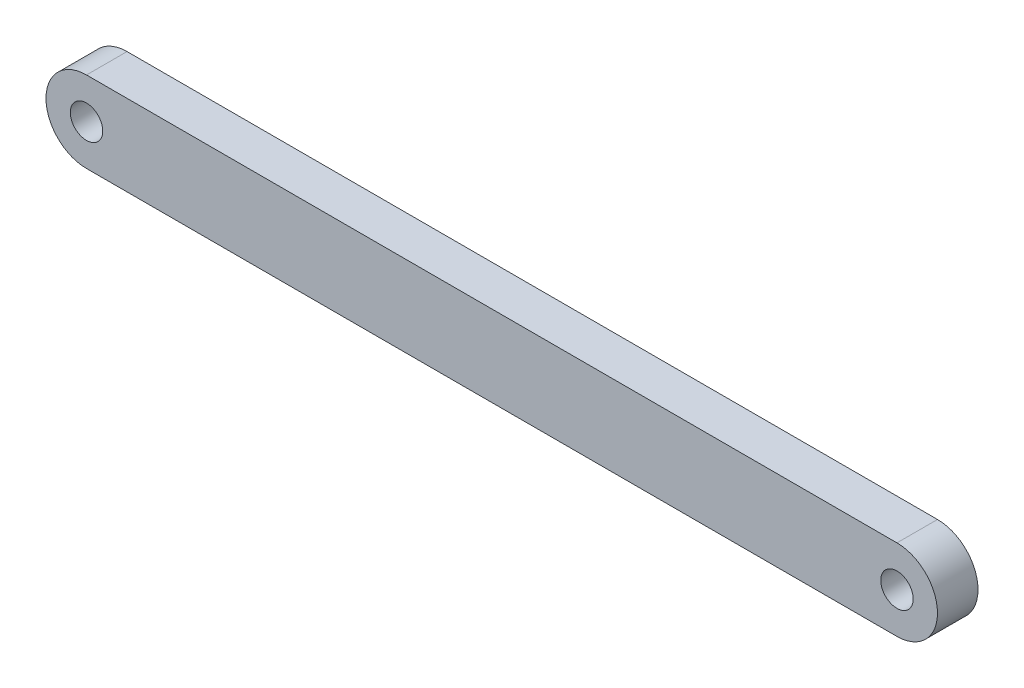
ISO-10303-21;
HEADER;
FILE_DESCRIPTION(('STEP AP214'),'2;1');
FILE_NAME('part.step','',(''),(''),'','','');
FILE_SCHEMA(('AUTOMOTIVE_DESIGN { 1 0 10303 214 1 1 1 1 }'));
ENDSEC;
DATA;
#1=APPLICATION_CONTEXT('core data for automotive mechanical design processes');
#2=APPLICATION_PROTOCOL_DEFINITION('international standard','automotive_design',2000,#1);
#3=PRODUCT_CONTEXT('',#1,'mechanical');
#4=PRODUCT('Part','Part','',(#3));
#5=PRODUCT_RELATED_PRODUCT_CATEGORY('part','',(#4));
#6=PRODUCT_DEFINITION_FORMATION('','',#4);
#7=PRODUCT_DEFINITION_CONTEXT('part definition',#1,'design');
#8=PRODUCT_DEFINITION('design','',#6,#7);
#9=PRODUCT_DEFINITION_SHAPE('','',#8);
#10=(LENGTH_UNIT() NAMED_UNIT(*) SI_UNIT(.MILLI.,.METRE.));
#11=(NAMED_UNIT(*) PLANE_ANGLE_UNIT() SI_UNIT($,.RADIAN.));
#12=(NAMED_UNIT(*) SI_UNIT($,.STERADIAN.) SOLID_ANGLE_UNIT());
#13=UNCERTAINTY_MEASURE_WITH_UNIT(LENGTH_MEASURE(1.E-05),#10,'distance_accuracy_value','');
#14=(GEOMETRIC_REPRESENTATION_CONTEXT(3) GLOBAL_UNCERTAINTY_ASSIGNED_CONTEXT((#13)) GLOBAL_UNIT_ASSIGNED_CONTEXT((#10,
#11,#12)) REPRESENTATION_CONTEXT('',''));
#15=CARTESIAN_POINT('',(0.,0.,0.));
#16=DIRECTION('',(0.,0.,1.));
#17=DIRECTION('',(1.,0.,0.));
#18=AXIS2_PLACEMENT_3D('',#15,#16,#17);
#19=CARTESIAN_POINT('',(0.,0.,5.));
#20=DIRECTION('',(0.,0.,1.));
#21=DIRECTION('',(1.,0.,0.));
#22=AXIS2_PLACEMENT_3D('',#19,#20,#21);
#23=PLANE('',#22);
#24=CARTESIAN_POINT('',(0.,0.,5.));
#25=DIRECTION('',(0.,0.,1.));
#26=DIRECTION('',(1.,0.,0.));
#27=AXIS2_PLACEMENT_3D('',#24,#25,#26);
#28=CIRCLE('',#27,2.);
#29=CARTESIAN_POINT('',(2.,0.,5.));
#30=VERTEX_POINT('',#29);
#31=EDGE_CURVE('E118',#30,#30,#28,.T.);
#32=ORIENTED_EDGE('',*,*,#31,.F.);
#33=EDGE_LOOP('',(#32));
#34=FACE_BOUND('',#33,.T.);
#35=CARTESIAN_POINT('',(0.,0.,5.));
#36=DIRECTION('',(0.,0.,1.));
#37=DIRECTION('',(1.,0.,0.));
#38=AXIS2_PLACEMENT_3D('',#35,#36,#37);
#39=CIRCLE('',#38,5.);
#40=CARTESIAN_POINT('',(0.,5.,5.));
#41=VERTEX_POINT('',#40);
#42=CARTESIAN_POINT('',(0.,-5.,5.));
#43=VERTEX_POINT('',#42);
#44=EDGE_CURVE('E98',#41,#43,#39,.T.);
#45=ORIENTED_EDGE('',*,*,#44,.T.);
#46=DIRECTION('',(1.,0.,0.));
#47=VECTOR('',#46,1.);
#48=CARTESIAN_POINT('',(0.,-5.,5.));
#49=LINE('',#48,#47);
#50=CARTESIAN_POINT('',(100.,-5.,5.));
#51=VERTEX_POINT('',#50);
#52=EDGE_CURVE('E93',#43,#51,#49,.T.);
#53=ORIENTED_EDGE('',*,*,#52,.T.);
#54=CARTESIAN_POINT('',(100.,0.,5.));
#55=DIRECTION('',(0.,0.,1.));
#56=DIRECTION('',(1.,0.,0.));
#57=AXIS2_PLACEMENT_3D('',#54,#55,#56);
#58=CIRCLE('',#57,5.);
#59=CARTESIAN_POINT('',(100.,5.,5.));
#60=VERTEX_POINT('',#59);
#61=EDGE_CURVE('E96',#51,#60,#58,.T.);
#62=ORIENTED_EDGE('',*,*,#61,.T.);
#63=DIRECTION('',(-1.,0.,0.));
#64=VECTOR('',#63,1.);
#65=CARTESIAN_POINT('',(0.,5.,5.));
#66=LINE('',#65,#64);
#67=EDGE_CURVE('E63',#60,#41,#66,.T.);
#68=ORIENTED_EDGE('',*,*,#67,.T.);
#69=EDGE_LOOP('',(#45,#53,#62,#68));
#70=FACE_BOUND('',#69,.T.);
#71=CARTESIAN_POINT('',(100.,0.,5.));
#72=DIRECTION('',(0.,0.,1.));
#73=DIRECTION('',(1.,0.,0.));
#74=AXIS2_PLACEMENT_3D('',#71,#72,#73);
#75=CIRCLE('',#74,2.00000000000001);
#76=CARTESIAN_POINT('',(102.,0.,5.));
#77=VERTEX_POINT('',#76);
#78=EDGE_CURVE('E140',#77,#77,#75,.T.);
#79=ORIENTED_EDGE('',*,*,#78,.F.);
#80=EDGE_LOOP('',(#79));
#81=FACE_BOUND('',#80,.T.);
#82=ADVANCED_FACE('F45',(#34,#70,#81),#23,.T.);
#83=CARTESIAN_POINT('',(0.,0.,0.));
#84=DIRECTION('',(0.,0.,1.));
#85=DIRECTION('',(1.,0.,0.));
#86=AXIS2_PLACEMENT_3D('',#83,#84,#85);
#87=PLANE('',#86);
#88=CARTESIAN_POINT('',(0.,0.,0.));
#89=DIRECTION('',(0.,0.,1.));
#90=DIRECTION('',(1.,0.,0.));
#91=AXIS2_PLACEMENT_3D('',#88,#89,#90);
#92=CIRCLE('',#91,5.);
#93=CARTESIAN_POINT('',(0.,5.,0.));
#94=VERTEX_POINT('',#93);
#95=CARTESIAN_POINT('',(0.,-5.,0.));
#96=VERTEX_POINT('',#95);
#97=EDGE_CURVE('E114',#94,#96,#92,.T.);
#98=ORIENTED_EDGE('',*,*,#97,.F.);
#99=DIRECTION('',(-1.,0.,0.));
#100=VECTOR('',#99,1.);
#101=CARTESIAN_POINT('',(0.,5.,0.));
#102=LINE('',#101,#100);
#103=CARTESIAN_POINT('',(100.,5.,0.));
#104=VERTEX_POINT('',#103);
#105=EDGE_CURVE('E86',#104,#94,#102,.T.);
#106=ORIENTED_EDGE('',*,*,#105,.F.);
#107=CARTESIAN_POINT('',(100.,0.,0.));
#108=DIRECTION('',(0.,0.,1.));
#109=DIRECTION('',(1.,0.,0.));
#110=AXIS2_PLACEMENT_3D('',#107,#108,#109);
#111=CIRCLE('',#110,5.);
#112=CARTESIAN_POINT('',(100.,-5.,0.));
#113=VERTEX_POINT('',#112);
#114=EDGE_CURVE('E80',#113,#104,#111,.T.);
#115=ORIENTED_EDGE('',*,*,#114,.F.);
#116=DIRECTION('',(1.,0.,0.));
#117=VECTOR('',#116,1.);
#118=CARTESIAN_POINT('',(0.,-5.,0.));
#119=LINE('',#118,#117);
#120=EDGE_CURVE('E103',#96,#113,#119,.T.);
#121=ORIENTED_EDGE('',*,*,#120,.F.);
#122=EDGE_LOOP('',(#98,#106,#115,#121));
#123=FACE_BOUND('',#122,.T.);
#124=CARTESIAN_POINT('',(0.,0.,0.));
#125=DIRECTION('',(0.,0.,1.));
#126=DIRECTION('',(1.,0.,0.));
#127=AXIS2_PLACEMENT_3D('',#124,#125,#126);
#128=CIRCLE('',#127,2.);
#129=CARTESIAN_POINT('',(2.,0.,0.));
#130=VERTEX_POINT('',#129);
#131=EDGE_CURVE('E136',#130,#130,#128,.T.);
#132=ORIENTED_EDGE('',*,*,#131,.T.);
#133=EDGE_LOOP('',(#132));
#134=FACE_BOUND('',#133,.T.);
#135=CARTESIAN_POINT('',(100.,0.,0.));
#136=DIRECTION('',(0.,0.,1.));
#137=DIRECTION('',(1.,0.,0.));
#138=AXIS2_PLACEMENT_3D('',#135,#136,#137);
#139=CIRCLE('',#138,2.00000000000001);
#140=CARTESIAN_POINT('',(102.,0.,0.));
#141=VERTEX_POINT('',#140);
#142=EDGE_CURVE('E144',#141,#141,#139,.T.);
#143=ORIENTED_EDGE('',*,*,#142,.T.);
#144=EDGE_LOOP('',(#143));
#145=FACE_BOUND('',#144,.T.);
#146=ADVANCED_FACE('F131',(#123,#134,#145),#87,.F.);
#147=CARTESIAN_POINT('',(0.,0.,5.));
#148=DIRECTION('',(0.,0.,-1.));
#149=DIRECTION('',(-1.,0.,0.));
#150=AXIS2_PLACEMENT_3D('',#147,#148,#149);
#151=CYLINDRICAL_SURFACE('',#150,5.);
#152=ORIENTED_EDGE('',*,*,#97,.T.);
#153=DIRECTION('',(0.,0.,-1.));
#154=VECTOR('',#153,1.);
#155=CARTESIAN_POINT('',(0.,-5.,5.));
#156=LINE('',#155,#154);
#157=EDGE_CURVE('E11',#43,#96,#156,.T.);
#158=ORIENTED_EDGE('',*,*,#157,.F.);
#159=ORIENTED_EDGE('',*,*,#44,.F.);
#160=DIRECTION('',(0.,0.,-1.));
#161=VECTOR('',#160,1.);
#162=CARTESIAN_POINT('',(0.,5.,5.));
#163=LINE('',#162,#161);
#164=EDGE_CURVE('E110',#41,#94,#163,.T.);
#165=ORIENTED_EDGE('',*,*,#164,.T.);
#166=EDGE_LOOP('',(#152,#158,#159,#165));
#167=FACE_BOUND('',#166,.T.);
#168=ADVANCED_FACE('F47',(#167),#151,.T.);
#169=CARTESIAN_POINT('',(0.,-5.,5.));
#170=DIRECTION('',(0.,1.,0.));
#171=DIRECTION('',(0.,0.,1.));
#172=AXIS2_PLACEMENT_3D('',#169,#170,#171);
#173=PLANE('',#172);
#174=ORIENTED_EDGE('',*,*,#120,.T.);
#175=DIRECTION('',(0.,0.,-1.));
#176=VECTOR('',#175,1.);
#177=CARTESIAN_POINT('',(100.,-5.,5.));
#178=LINE('',#177,#176);
#179=EDGE_CURVE('E55',#51,#113,#178,.T.);
#180=ORIENTED_EDGE('',*,*,#179,.F.);
#181=ORIENTED_EDGE('',*,*,#52,.F.);
#182=ORIENTED_EDGE('',*,*,#157,.T.);
#183=EDGE_LOOP('',(#174,#180,#181,#182));
#184=FACE_BOUND('',#183,.T.);
#185=ADVANCED_FACE('F102',(#184),#173,.F.);
#186=CARTESIAN_POINT('',(100.,0.,5.));
#187=DIRECTION('',(0.,0.,-1.));
#188=DIRECTION('',(-1.,0.,0.));
#189=AXIS2_PLACEMENT_3D('',#186,#187,#188);
#190=CYLINDRICAL_SURFACE('',#189,5.);
#191=ORIENTED_EDGE('',*,*,#114,.T.);
#192=DIRECTION('',(0.,0.,-1.));
#193=VECTOR('',#192,1.);
#194=CARTESIAN_POINT('',(100.,5.,5.));
#195=LINE('',#194,#193);
#196=EDGE_CURVE('E105',#60,#104,#195,.T.);
#197=ORIENTED_EDGE('',*,*,#196,.F.);
#198=ORIENTED_EDGE('',*,*,#61,.F.);
#199=ORIENTED_EDGE('',*,*,#179,.T.);
#200=EDGE_LOOP('',(#191,#197,#198,#199));
#201=FACE_BOUND('',#200,.T.);
#202=ADVANCED_FACE('F106',(#201),#190,.T.);
#203=CARTESIAN_POINT('',(0.,5.,5.));
#204=DIRECTION('',(0.,-1.,0.));
#205=DIRECTION('',(0.,0.,-1.));
#206=AXIS2_PLACEMENT_3D('',#203,#204,#205);
#207=PLANE('',#206);
#208=ORIENTED_EDGE('',*,*,#105,.T.);
#209=ORIENTED_EDGE('',*,*,#164,.F.);
#210=ORIENTED_EDGE('',*,*,#67,.F.);
#211=ORIENTED_EDGE('',*,*,#196,.T.);
#212=EDGE_LOOP('',(#208,#209,#210,#211));
#213=FACE_BOUND('',#212,.T.);
#214=ADVANCED_FACE('F128',(#213),#207,.F.);
#215=CARTESIAN_POINT('',(0.,0.,5.));
#216=DIRECTION('',(0.,0.,-1.));
#217=DIRECTION('',(-1.,0.,0.));
#218=AXIS2_PLACEMENT_3D('',#215,#216,#217);
#219=CYLINDRICAL_SURFACE('',#218,2.);
#220=ORIENTED_EDGE('',*,*,#31,.T.);
#221=EDGE_LOOP('',(#220));
#222=FACE_BOUND('',#221,.T.);
#223=ORIENTED_EDGE('',*,*,#131,.F.);
#224=EDGE_LOOP('',(#223));
#225=FACE_BOUND('',#224,.T.);
#226=ADVANCED_FACE('F163',(#222,#225),#219,.F.);
#227=CARTESIAN_POINT('',(100.,0.,5.));
#228=DIRECTION('',(0.,0.,-1.));
#229=DIRECTION('',(-1.,0.,0.));
#230=AXIS2_PLACEMENT_3D('',#227,#228,#229);
#231=CYLINDRICAL_SURFACE('',#230,2.00000000000001);
#232=ORIENTED_EDGE('',*,*,#78,.T.);
#233=EDGE_LOOP('',(#232));
#234=FACE_BOUND('',#233,.T.);
#235=ORIENTED_EDGE('',*,*,#142,.F.);
#236=EDGE_LOOP('',(#235));
#237=FACE_BOUND('',#236,.T.);
#238=ADVANCED_FACE('F152',(#234,#237),#231,.F.);
#239=CLOSED_SHELL('',(#82,#146,#168,#185,#202,#214,#226,#238));
#240=MANIFOLD_SOLID_BREP('B2',#239);
#241=ADVANCED_BREP_SHAPE_REPRESENTATION('',(#18,#240),#14);
#242=SHAPE_DEFINITION_REPRESENTATION(#9,#241);
ENDSEC;
END-ISO-10303-21;
